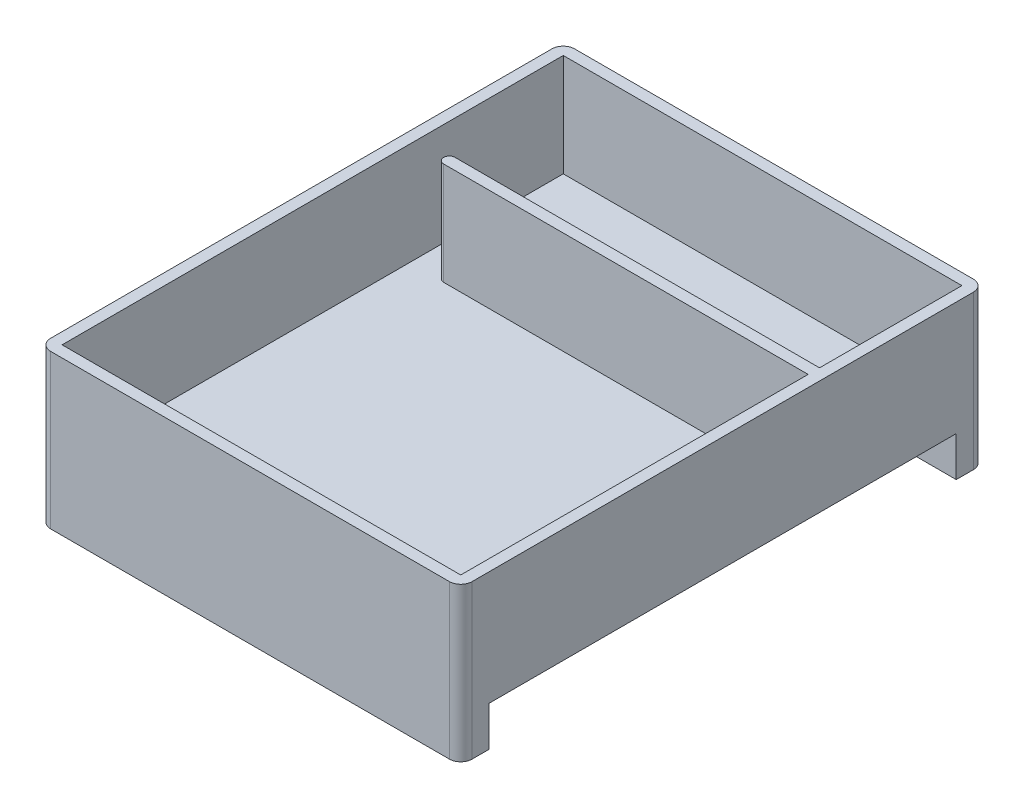
ISO-10303-21;
HEADER;
FILE_DESCRIPTION(('STEP AP214'),'2;1');
FILE_NAME('part.step','',(''),(''),'','','');
FILE_SCHEMA(('AUTOMOTIVE_DESIGN { 1 0 10303 214 1 1 1 1 }'));
ENDSEC;
DATA;
#1=APPLICATION_CONTEXT('core data for automotive mechanical design processes');
#2=APPLICATION_PROTOCOL_DEFINITION('international standard','automotive_design',2000,#1);
#3=PRODUCT_CONTEXT('',#1,'mechanical');
#4=PRODUCT('Part','Part','',(#3));
#5=PRODUCT_RELATED_PRODUCT_CATEGORY('part','',(#4));
#6=PRODUCT_DEFINITION_FORMATION('','',#4);
#7=PRODUCT_DEFINITION_CONTEXT('part definition',#1,'design');
#8=PRODUCT_DEFINITION('design','',#6,#7);
#9=PRODUCT_DEFINITION_SHAPE('','',#8);
#10=(LENGTH_UNIT() NAMED_UNIT(*) SI_UNIT(.MILLI.,.METRE.));
#11=(NAMED_UNIT(*) PLANE_ANGLE_UNIT() SI_UNIT($,.RADIAN.));
#12=(NAMED_UNIT(*) SI_UNIT($,.STERADIAN.) SOLID_ANGLE_UNIT());
#13=UNCERTAINTY_MEASURE_WITH_UNIT(LENGTH_MEASURE(1.E-05),#10,'distance_accuracy_value','');
#14=(GEOMETRIC_REPRESENTATION_CONTEXT(3) GLOBAL_UNCERTAINTY_ASSIGNED_CONTEXT((#13)) GLOBAL_UNIT_ASSIGNED_CONTEXT((#10,
#11,#12)) REPRESENTATION_CONTEXT('',''));
#15=CARTESIAN_POINT('',(0.,0.,0.));
#16=DIRECTION('',(0.,0.,1.));
#17=DIRECTION('',(1.,0.,0.));
#18=AXIS2_PLACEMENT_3D('',#15,#16,#17);
#19=CARTESIAN_POINT('',(0.,0.,0.));
#20=DIRECTION('',(0.,-1.,0.));
#21=DIRECTION('',(0.,0.,-1.));
#22=AXIS2_PLACEMENT_3D('',#19,#20,#21);
#23=PLANE('',#22);
#24=DIRECTION('',(0.,0.,1.));
#25=VECTOR('',#24,1.);
#26=CARTESIAN_POINT('',(0.,0.,0.));
#27=LINE('',#26,#25);
#28=CARTESIAN_POINT('',(0.,0.,-87.));
#29=VERTEX_POINT('',#28);
#30=CARTESIAN_POINT('',(0.,0.,-5.));
#31=VERTEX_POINT('',#30);
#32=EDGE_CURVE('E282',#29,#31,#27,.T.);
#33=ORIENTED_EDGE('',*,*,#32,.F.);
#34=DIRECTION('',(-1.,0.,0.));
#35=VECTOR('',#34,1.);
#36=CARTESIAN_POINT('',(0.,0.,-87.));
#37=LINE('',#36,#35);
#38=CARTESIAN_POINT('',(74.,0.,-87.));
#39=VERTEX_POINT('',#38);
#40=EDGE_CURVE('E198',#39,#29,#37,.T.);
#41=ORIENTED_EDGE('',*,*,#40,.F.);
#42=DIRECTION('',(0.,0.,-1.));
#43=VECTOR('',#42,1.);
#44=CARTESIAN_POINT('',(74.,0.,0.));
#45=LINE('',#44,#43);
#46=CARTESIAN_POINT('',(74.,0.,-5.));
#47=VERTEX_POINT('',#46);
#48=EDGE_CURVE('E290',#47,#39,#45,.T.);
#49=ORIENTED_EDGE('',*,*,#48,.F.);
#50=DIRECTION('',(1.,0.,0.));
#51=VECTOR('',#50,1.);
#52=CARTESIAN_POINT('',(0.,0.,-5.));
#53=LINE('',#52,#51);
#54=EDGE_CURVE('E209',#31,#47,#53,.T.);
#55=ORIENTED_EDGE('',*,*,#54,.F.);
#56=EDGE_LOOP('',(#33,#41,#49,#55));
#57=FACE_BOUND('',#56,.T.);
#58=ADVANCED_FACE('F39',(#57),#23,.T.);
#59=CARTESIAN_POINT('',(0.,20.,0.));
#60=DIRECTION('',(1.,0.,0.));
#61=DIRECTION('',(0.,0.,-1.));
#62=AXIS2_PLACEMENT_3D('',#59,#60,#61);
#63=PLANE('',#62);
#64=DIRECTION('',(0.,0.,1.));
#65=VECTOR('',#64,1.);
#66=CARTESIAN_POINT('',(0.,20.,0.));
#67=LINE('',#66,#65);
#68=CARTESIAN_POINT('',(0.,20.,-90.));
#69=VERTEX_POINT('',#68);
#70=CARTESIAN_POINT('',(0.,20.,-2.));
#71=VERTEX_POINT('',#70);
#72=EDGE_CURVE('E287',#69,#71,#67,.T.);
#73=ORIENTED_EDGE('',*,*,#72,.F.);
#74=DIRECTION('',(0.,-1.,0.));
#75=VECTOR('',#74,1.);
#76=CARTESIAN_POINT('',(0.,-7.,-90.));
#77=LINE('',#76,#75);
#78=CARTESIAN_POINT('',(0.,-7.,-90.));
#79=VERTEX_POINT('',#78);
#80=EDGE_CURVE('E206',#69,#79,#77,.T.);
#81=ORIENTED_EDGE('',*,*,#80,.T.);
#82=DIRECTION('',(0.,0.,-1.));
#83=VECTOR('',#82,1.);
#84=CARTESIAN_POINT('',(0.,-7.,-92.));
#85=LINE('',#84,#83);
#86=CARTESIAN_POINT('',(0.,-7.,-87.));
#87=VERTEX_POINT('',#86);
#88=EDGE_CURVE('E187',#87,#79,#85,.T.);
#89=ORIENTED_EDGE('',*,*,#88,.F.);
#90=DIRECTION('',(0.,1.,0.));
#91=VECTOR('',#90,1.);
#92=CARTESIAN_POINT('',(0.,-7.,-87.));
#93=LINE('',#92,#91);
#94=EDGE_CURVE('E193',#87,#29,#93,.T.);
#95=ORIENTED_EDGE('',*,*,#94,.T.);
#96=ORIENTED_EDGE('',*,*,#32,.T.);
#97=DIRECTION('',(0.,1.,0.));
#98=VECTOR('',#97,1.);
#99=CARTESIAN_POINT('',(0.,-7.,-5.));
#100=LINE('',#99,#98);
#101=CARTESIAN_POINT('',(0.,-7.,-5.));
#102=VERTEX_POINT('',#101);
#103=EDGE_CURVE('E229',#102,#31,#100,.T.);
#104=ORIENTED_EDGE('',*,*,#103,.F.);
#105=DIRECTION('',(0.,0.,-1.));
#106=VECTOR('',#105,1.);
#107=CARTESIAN_POINT('',(0.,-7.,0.));
#108=LINE('',#107,#106);
#109=CARTESIAN_POINT('',(0.,-7.,-2.));
#110=VERTEX_POINT('',#109);
#111=EDGE_CURVE('E215',#110,#102,#108,.T.);
#112=ORIENTED_EDGE('',*,*,#111,.F.);
#113=DIRECTION('',(0.,-1.,0.));
#114=VECTOR('',#113,1.);
#115=CARTESIAN_POINT('',(0.,20.,-2.));
#116=LINE('',#115,#114);
#117=EDGE_CURVE('E304',#110,#71,#116,.F.);
#118=ORIENTED_EDGE('',*,*,#117,.T.);
#119=EDGE_LOOP('',(#73,#81,#89,#95,#96,#104,#112,#118));
#120=FACE_BOUND('',#119,.T.);
#121=ADVANCED_FACE('F204',(#120),#63,.F.);
#122=CARTESIAN_POINT('',(0.,20.,0.));
#123=DIRECTION('',(0.,0.,-1.));
#124=DIRECTION('',(-1.,0.,0.));
#125=AXIS2_PLACEMENT_3D('',#122,#123,#124);
#126=PLANE('',#125);
#127=DIRECTION('',(-1.,0.,0.));
#128=VECTOR('',#127,1.);
#129=CARTESIAN_POINT('',(0.,-7.,0.));
#130=LINE('',#129,#128);
#131=CARTESIAN_POINT('',(72.,-7.,0.));
#132=VERTEX_POINT('',#131);
#133=CARTESIAN_POINT('',(2.,-7.,0.));
#134=VERTEX_POINT('',#133);
#135=EDGE_CURVE('E222',#132,#134,#130,.T.);
#136=ORIENTED_EDGE('',*,*,#135,.F.);
#137=DIRECTION('',(0.,-1.,0.));
#138=VECTOR('',#137,1.);
#139=CARTESIAN_POINT('',(72.,20.,0.));
#140=LINE('',#139,#138);
#141=CARTESIAN_POINT('',(72.,20.,0.));
#142=VERTEX_POINT('',#141);
#143=EDGE_CURVE('E314',#132,#142,#140,.F.);
#144=ORIENTED_EDGE('',*,*,#143,.T.);
#145=DIRECTION('',(1.,0.,0.));
#146=VECTOR('',#145,1.);
#147=CARTESIAN_POINT('',(0.,20.,0.));
#148=LINE('',#147,#146);
#149=CARTESIAN_POINT('',(2.,20.,0.));
#150=VERTEX_POINT('',#149);
#151=EDGE_CURVE('E289',#150,#142,#148,.T.);
#152=ORIENTED_EDGE('',*,*,#151,.F.);
#153=DIRECTION('',(0.,-1.,0.));
#154=VECTOR('',#153,1.);
#155=CARTESIAN_POINT('',(2.,20.,0.));
#156=LINE('',#155,#154);
#157=EDGE_CURVE('E296',#150,#134,#156,.T.);
#158=ORIENTED_EDGE('',*,*,#157,.T.);
#159=EDGE_LOOP('',(#136,#144,#152,#158));
#160=FACE_BOUND('',#159,.T.);
#161=ADVANCED_FACE('F385',(#160),#126,.F.);
#162=CARTESIAN_POINT('',(74.,20.,0.));
#163=DIRECTION('',(-1.,0.,0.));
#164=DIRECTION('',(0.,0.,1.));
#165=AXIS2_PLACEMENT_3D('',#162,#163,#164);
#166=PLANE('',#165);
#167=DIRECTION('',(0.,0.,1.));
#168=VECTOR('',#167,1.);
#169=CARTESIAN_POINT('',(74.,-7.,-92.));
#170=LINE('',#169,#168);
#171=CARTESIAN_POINT('',(74.,-7.,-90.));
#172=VERTEX_POINT('',#171);
#173=CARTESIAN_POINT('',(74.,-7.,-87.));
#174=VERTEX_POINT('',#173);
#175=EDGE_CURVE('E189',#172,#174,#170,.T.);
#176=ORIENTED_EDGE('',*,*,#175,.F.);
#177=DIRECTION('',(0.,-1.,0.));
#178=VECTOR('',#177,1.);
#179=CARTESIAN_POINT('',(74.,20.,-90.));
#180=LINE('',#179,#178);
#181=CARTESIAN_POINT('',(74.,20.,-90.));
#182=VERTEX_POINT('',#181);
#183=EDGE_CURVE('E332',#172,#182,#180,.F.);
#184=ORIENTED_EDGE('',*,*,#183,.T.);
#185=DIRECTION('',(0.,0.,-1.));
#186=VECTOR('',#185,1.);
#187=CARTESIAN_POINT('',(74.,20.,0.));
#188=LINE('',#187,#186);
#189=CARTESIAN_POINT('',(74.,20.,-2.));
#190=VERTEX_POINT('',#189);
#191=EDGE_CURVE('E293',#190,#182,#188,.T.);
#192=ORIENTED_EDGE('',*,*,#191,.F.);
#193=DIRECTION('',(0.,-1.,0.));
#194=VECTOR('',#193,1.);
#195=CARTESIAN_POINT('',(74.,20.,-2.));
#196=LINE('',#195,#194);
#197=CARTESIAN_POINT('',(74.,-7.,-2.));
#198=VERTEX_POINT('',#197);
#199=EDGE_CURVE('E309',#190,#198,#196,.T.);
#200=ORIENTED_EDGE('',*,*,#199,.T.);
#201=DIRECTION('',(0.,0.,1.));
#202=VECTOR('',#201,1.);
#203=CARTESIAN_POINT('',(74.,-7.,0.));
#204=LINE('',#203,#202);
#205=CARTESIAN_POINT('',(74.,-7.,-5.));
#206=VERTEX_POINT('',#205);
#207=EDGE_CURVE('E219',#206,#198,#204,.T.);
#208=ORIENTED_EDGE('',*,*,#207,.F.);
#209=DIRECTION('',(0.,1.,0.));
#210=VECTOR('',#209,1.);
#211=CARTESIAN_POINT('',(74.,-7.,-5.));
#212=LINE('',#211,#210);
#213=EDGE_CURVE('E224',#206,#47,#212,.T.);
#214=ORIENTED_EDGE('',*,*,#213,.T.);
#215=ORIENTED_EDGE('',*,*,#48,.T.);
#216=DIRECTION('',(0.,1.,0.));
#217=VECTOR('',#216,1.);
#218=CARTESIAN_POINT('',(74.,-7.,-87.));
#219=LINE('',#218,#217);
#220=EDGE_CURVE('E200',#174,#39,#219,.T.);
#221=ORIENTED_EDGE('',*,*,#220,.F.);
#222=EDGE_LOOP('',(#176,#184,#192,#200,#208,#214,#215,#221));
#223=FACE_BOUND('',#222,.T.);
#224=ADVANCED_FACE('F362',(#223),#166,.F.);
#225=CARTESIAN_POINT('',(0.,20.,0.));
#226=DIRECTION('',(0.,-1.,0.));
#227=DIRECTION('',(0.,0.,-1.));
#228=AXIS2_PLACEMENT_3D('',#225,#226,#227);
#229=PLANE('',#228);
#230=DIRECTION('',(1.,0.,0.));
#231=VECTOR('',#230,1.);
#232=CARTESIAN_POINT('',(0.,20.,-65.));
#233=LINE('',#232,#231);
#234=CARTESIAN_POINT('',(8.,20.,-65.));
#235=VERTEX_POINT('',#234);
#236=CARTESIAN_POINT('',(72.,20.,-65.));
#237=VERTEX_POINT('',#236);
#238=EDGE_CURVE('E237',#235,#237,#233,.T.);
#239=ORIENTED_EDGE('',*,*,#238,.F.);
#240=CARTESIAN_POINT('',(8.,20.,-64.));
#241=DIRECTION('',(0.,-1.,0.));
#242=DIRECTION('',(0.,0.,-1.));
#243=AXIS2_PLACEMENT_3D('',#240,#241,#242);
#244=CIRCLE('',#243,1.);
#245=CARTESIAN_POINT('',(7.,20.,-64.));
#246=VERTEX_POINT('',#245);
#247=EDGE_CURVE('E339',#235,#246,#244,.F.);
#248=ORIENTED_EDGE('',*,*,#247,.T.);
#249=CARTESIAN_POINT('',(8.,20.,-64.));
#250=DIRECTION('',(0.,-1.,0.));
#251=DIRECTION('',(0.,0.,-1.));
#252=AXIS2_PLACEMENT_3D('',#249,#250,#251);
#253=CIRCLE('',#252,1.);
#254=CARTESIAN_POINT('',(8.,20.,-63.));
#255=VERTEX_POINT('',#254);
#256=EDGE_CURVE('E337',#246,#255,#253,.F.);
#257=ORIENTED_EDGE('',*,*,#256,.T.);
#258=DIRECTION('',(-1.,0.,0.));
#259=VECTOR('',#258,1.);
#260=CARTESIAN_POINT('',(2.,20.,-63.));
#261=LINE('',#260,#259);
#262=CARTESIAN_POINT('',(72.,20.,-63.));
#263=VERTEX_POINT('',#262);
#264=EDGE_CURVE('E273',#263,#255,#261,.T.);
#265=ORIENTED_EDGE('',*,*,#264,.F.);
#266=DIRECTION('',(0.,0.,-1.));
#267=VECTOR('',#266,1.);
#268=CARTESIAN_POINT('',(72.,20.,-63.));
#269=LINE('',#268,#267);
#270=CARTESIAN_POINT('',(72.,20.,-2.));
#271=VERTEX_POINT('',#270);
#272=EDGE_CURVE('E258',#271,#263,#269,.T.);
#273=ORIENTED_EDGE('',*,*,#272,.F.);
#274=DIRECTION('',(1.,0.,0.));
#275=VECTOR('',#274,1.);
#276=CARTESIAN_POINT('',(2.00000000000001,20.,-2.));
#277=LINE('',#276,#275);
#278=CARTESIAN_POINT('',(2.00000000000001,20.,-2.));
#279=VERTEX_POINT('',#278);
#280=EDGE_CURVE('E263',#279,#271,#277,.T.);
#281=ORIENTED_EDGE('',*,*,#280,.F.);
#282=DIRECTION('',(0.,0.,1.));
#283=VECTOR('',#282,1.);
#284=CARTESIAN_POINT('',(2.,20.,-63.));
#285=LINE('',#284,#283);
#286=CARTESIAN_POINT('',(2.,20.,-90.));
#287=VERTEX_POINT('',#286);
#288=EDGE_CURVE('E275',#287,#279,#285,.T.);
#289=ORIENTED_EDGE('',*,*,#288,.F.);
#290=DIRECTION('',(1.,0.,0.));
#291=VECTOR('',#290,1.);
#292=CARTESIAN_POINT('',(0.,20.,-90.));
#293=LINE('',#292,#291);
#294=CARTESIAN_POINT('',(72.,20.,-90.));
#295=VERTEX_POINT('',#294);
#296=EDGE_CURVE('E244',#287,#295,#293,.T.);
#297=ORIENTED_EDGE('',*,*,#296,.T.);
#298=DIRECTION('',(0.,0.,1.));
#299=VECTOR('',#298,1.);
#300=CARTESIAN_POINT('',(72.,20.,0.));
#301=LINE('',#300,#299);
#302=EDGE_CURVE('E232',#295,#237,#301,.T.);
#303=ORIENTED_EDGE('',*,*,#302,.T.);
#304=EDGE_LOOP('',(#239,#248,#257,#265,#273,#281,#289,#297,#303));
#305=FACE_BOUND('',#304,.T.);
#306=DIRECTION('',(1.,0.,0.));
#307=VECTOR('',#306,1.);
#308=CARTESIAN_POINT('',(0.,20.,-92.));
#309=LINE('',#308,#307);
#310=CARTESIAN_POINT('',(2.,20.,-92.));
#311=VERTEX_POINT('',#310);
#312=CARTESIAN_POINT('',(72.,20.,-92.));
#313=VERTEX_POINT('',#312);
#314=EDGE_CURVE('E251',#311,#313,#309,.T.);
#315=ORIENTED_EDGE('',*,*,#314,.F.);
#316=CARTESIAN_POINT('',(2.,20.,-90.));
#317=DIRECTION('',(0.,-1.,0.));
#318=DIRECTION('',(0.,0.,-1.));
#319=AXIS2_PLACEMENT_3D('',#316,#317,#318);
#320=CIRCLE('',#319,2.);
#321=EDGE_CURVE('E330',#311,#69,#320,.F.);
#322=ORIENTED_EDGE('',*,*,#321,.T.);
#323=ORIENTED_EDGE('',*,*,#72,.T.);
#324=CARTESIAN_POINT('',(2.,20.,-2.));
#325=DIRECTION('',(0.,-1.,0.));
#326=DIRECTION('',(0.,0.,-1.));
#327=AXIS2_PLACEMENT_3D('',#324,#325,#326);
#328=CIRCLE('',#327,2.);
#329=EDGE_CURVE('E307',#71,#150,#328,.F.);
#330=ORIENTED_EDGE('',*,*,#329,.T.);
#331=ORIENTED_EDGE('',*,*,#151,.T.);
#332=CARTESIAN_POINT('',(72.,20.,-2.));
#333=DIRECTION('',(0.,-1.,0.));
#334=DIRECTION('',(0.,0.,-1.));
#335=AXIS2_PLACEMENT_3D('',#332,#333,#334);
#336=CIRCLE('',#335,2.);
#337=EDGE_CURVE('E316',#142,#190,#336,.F.);
#338=ORIENTED_EDGE('',*,*,#337,.T.);
#339=ORIENTED_EDGE('',*,*,#191,.T.);
#340=CARTESIAN_POINT('',(72.,20.,-90.));
#341=DIRECTION('',(0.,-1.,0.));
#342=DIRECTION('',(0.,0.,-1.));
#343=AXIS2_PLACEMENT_3D('',#340,#341,#342);
#344=CIRCLE('',#343,2.);
#345=EDGE_CURVE('E328',#182,#313,#344,.F.);
#346=ORIENTED_EDGE('',*,*,#345,.T.);
#347=EDGE_LOOP('',(#315,#322,#323,#330,#331,#338,#339,#346));
#348=FACE_BOUND('',#347,.T.);
#349=ADVANCED_FACE('F356',(#305,#348),#229,.F.);
#350=CARTESIAN_POINT('',(72.,2.,-63.));
#351=DIRECTION('',(1.,0.,0.));
#352=DIRECTION('',(0.,0.,-1.));
#353=AXIS2_PLACEMENT_3D('',#350,#351,#352);
#354=PLANE('',#353);
#355=ORIENTED_EDGE('',*,*,#272,.T.);
#356=DIRECTION('',(0.,1.,0.));
#357=VECTOR('',#356,1.);
#358=CARTESIAN_POINT('',(72.,2.,-63.));
#359=LINE('',#358,#357);
#360=CARTESIAN_POINT('',(72.,2.,-63.));
#361=VERTEX_POINT('',#360);
#362=EDGE_CURVE('E271',#361,#263,#359,.T.);
#363=ORIENTED_EDGE('',*,*,#362,.F.);
#364=DIRECTION('',(0.,0.,-1.));
#365=VECTOR('',#364,1.);
#366=CARTESIAN_POINT('',(72.,2.,-63.));
#367=LINE('',#366,#365);
#368=CARTESIAN_POINT('',(72.,2.,-2.));
#369=VERTEX_POINT('',#368);
#370=EDGE_CURVE('E259',#369,#361,#367,.T.);
#371=ORIENTED_EDGE('',*,*,#370,.F.);
#372=DIRECTION('',(0.,1.,0.));
#373=VECTOR('',#372,1.);
#374=CARTESIAN_POINT('',(72.,2.,-2.));
#375=LINE('',#374,#373);
#376=EDGE_CURVE('E280',#369,#271,#375,.T.);
#377=ORIENTED_EDGE('',*,*,#376,.T.);
#378=EDGE_LOOP('',(#355,#363,#371,#377));
#379=FACE_BOUND('',#378,.T.);
#380=ADVANCED_FACE('F457',(#379),#354,.F.);
#381=CARTESIAN_POINT('',(2.00000000000001,2.,-2.));
#382=DIRECTION('',(0.,0.,1.));
#383=DIRECTION('',(1.,0.,0.));
#384=AXIS2_PLACEMENT_3D('',#381,#382,#383);
#385=PLANE('',#384);
#386=ORIENTED_EDGE('',*,*,#280,.T.);
#387=ORIENTED_EDGE('',*,*,#376,.F.);
#388=DIRECTION('',(1.,0.,0.));
#389=VECTOR('',#388,1.);
#390=CARTESIAN_POINT('',(2.00000000000001,2.,-2.));
#391=LINE('',#390,#389);
#392=CARTESIAN_POINT('',(2.00000000000001,2.,-2.));
#393=VERTEX_POINT('',#392);
#394=EDGE_CURVE('E268',#393,#369,#391,.T.);
#395=ORIENTED_EDGE('',*,*,#394,.F.);
#396=DIRECTION('',(0.,1.,0.));
#397=VECTOR('',#396,1.);
#398=CARTESIAN_POINT('',(2.00000000000001,2.,-2.));
#399=LINE('',#398,#397);
#400=EDGE_CURVE('E283',#393,#279,#399,.T.);
#401=ORIENTED_EDGE('',*,*,#400,.T.);
#402=EDGE_LOOP('',(#386,#387,#395,#401));
#403=FACE_BOUND('',#402,.T.);
#404=ADVANCED_FACE('F453',(#403),#385,.F.);
#405=CARTESIAN_POINT('',(2.,2.,-63.));
#406=DIRECTION('',(-1.,0.,0.));
#407=DIRECTION('',(0.,0.,1.));
#408=AXIS2_PLACEMENT_3D('',#405,#406,#407);
#409=PLANE('',#408);
#410=ORIENTED_EDGE('',*,*,#288,.T.);
#411=ORIENTED_EDGE('',*,*,#400,.F.);
#412=DIRECTION('',(0.,0.,1.));
#413=VECTOR('',#412,1.);
#414=CARTESIAN_POINT('',(2.,2.,-63.));
#415=LINE('',#414,#413);
#416=CARTESIAN_POINT('',(2.,2.,-90.));
#417=VERTEX_POINT('',#416);
#418=EDGE_CURVE('E265',#417,#393,#415,.T.);
#419=ORIENTED_EDGE('',*,*,#418,.F.);
#420=DIRECTION('',(0.,1.,0.));
#421=VECTOR('',#420,1.);
#422=CARTESIAN_POINT('',(2.,2.,-90.));
#423=LINE('',#422,#421);
#424=EDGE_CURVE('E252',#417,#287,#423,.T.);
#425=ORIENTED_EDGE('',*,*,#424,.T.);
#426=EDGE_LOOP('',(#410,#411,#419,#425));
#427=FACE_BOUND('',#426,.T.);
#428=ADVANCED_FACE('F456',(#427),#409,.F.);
#429=CARTESIAN_POINT('',(2.,2.,-63.));
#430=DIRECTION('',(0.,0.,-1.));
#431=DIRECTION('',(-1.,0.,0.));
#432=AXIS2_PLACEMENT_3D('',#429,#430,#431);
#433=PLANE('',#432);
#434=ORIENTED_EDGE('',*,*,#264,.T.);
#435=DIRECTION('',(0.,1.,0.));
#436=VECTOR('',#435,1.);
#437=CARTESIAN_POINT('',(8.,2.,-63.));
#438=LINE('',#437,#436);
#439=CARTESIAN_POINT('',(8.,2.,-63.));
#440=VERTEX_POINT('',#439);
#441=EDGE_CURVE('E61',#255,#440,#438,.F.);
#442=ORIENTED_EDGE('',*,*,#441,.T.);
#443=DIRECTION('',(-1.,0.,0.));
#444=VECTOR('',#443,1.);
#445=CARTESIAN_POINT('',(2.,2.,-63.));
#446=LINE('',#445,#444);
#447=EDGE_CURVE('E262',#361,#440,#446,.T.);
#448=ORIENTED_EDGE('',*,*,#447,.F.);
#449=ORIENTED_EDGE('',*,*,#362,.T.);
#450=EDGE_LOOP('',(#434,#442,#448,#449));
#451=FACE_BOUND('',#450,.T.);
#452=ADVANCED_FACE('F452',(#451),#433,.F.);
#453=CARTESIAN_POINT('',(0.,2.,0.));
#454=DIRECTION('',(0.,1.,0.));
#455=DIRECTION('',(0.,0.,1.));
#456=AXIS2_PLACEMENT_3D('',#453,#454,#455);
#457=PLANE('',#456);
#458=ORIENTED_EDGE('',*,*,#370,.T.);
#459=ORIENTED_EDGE('',*,*,#447,.T.);
#460=CARTESIAN_POINT('',(8.,2.,-64.));
#461=DIRECTION('',(0.,1.,0.));
#462=DIRECTION('',(0.,0.,1.));
#463=AXIS2_PLACEMENT_3D('',#460,#461,#462);
#464=CIRCLE('',#463,1.);
#465=CARTESIAN_POINT('',(7.,2.,-64.));
#466=VERTEX_POINT('',#465);
#467=EDGE_CURVE('E11',#440,#466,#464,.F.);
#468=ORIENTED_EDGE('',*,*,#467,.T.);
#469=CARTESIAN_POINT('',(8.,2.,-64.));
#470=DIRECTION('',(0.,1.,0.));
#471=DIRECTION('',(0.,0.,1.));
#472=AXIS2_PLACEMENT_3D('',#469,#470,#471);
#473=CIRCLE('',#472,1.);
#474=CARTESIAN_POINT('',(8.,2.,-65.));
#475=VERTEX_POINT('',#474);
#476=EDGE_CURVE('E48',#466,#475,#473,.F.);
#477=ORIENTED_EDGE('',*,*,#476,.T.);
#478=DIRECTION('',(1.,0.,0.));
#479=VECTOR('',#478,1.);
#480=CARTESIAN_POINT('',(0.,2.,-65.));
#481=LINE('',#480,#479);
#482=CARTESIAN_POINT('',(72.,2.,-65.));
#483=VERTEX_POINT('',#482);
#484=EDGE_CURVE('E239',#475,#483,#481,.T.);
#485=ORIENTED_EDGE('',*,*,#484,.T.);
#486=DIRECTION('',(0.,0.,1.));
#487=VECTOR('',#486,1.);
#488=CARTESIAN_POINT('',(72.,2.,0.));
#489=LINE('',#488,#487);
#490=CARTESIAN_POINT('',(72.,2.,-90.));
#491=VERTEX_POINT('',#490);
#492=EDGE_CURVE('E233',#491,#483,#489,.T.);
#493=ORIENTED_EDGE('',*,*,#492,.F.);
#494=DIRECTION('',(1.,0.,0.));
#495=VECTOR('',#494,1.);
#496=CARTESIAN_POINT('',(0.,2.,-90.));
#497=LINE('',#496,#495);
#498=EDGE_CURVE('E236',#417,#491,#497,.T.);
#499=ORIENTED_EDGE('',*,*,#498,.F.);
#500=ORIENTED_EDGE('',*,*,#418,.T.);
#501=ORIENTED_EDGE('',*,*,#394,.T.);
#502=EDGE_LOOP('',(#458,#459,#468,#477,#485,#493,#499,#500,#501));
#503=FACE_BOUND('',#502,.T.);
#504=ADVANCED_FACE('F344',(#503),#457,.T.);
#505=CARTESIAN_POINT('',(0.,20.,-92.));
#506=DIRECTION('',(0.,0.,-1.));
#507=DIRECTION('',(-1.,0.,0.));
#508=AXIS2_PLACEMENT_3D('',#505,#506,#507);
#509=PLANE('',#508);
#510=DIRECTION('',(1.,0.,0.));
#511=VECTOR('',#510,1.);
#512=CARTESIAN_POINT('',(0.,-7.,-92.));
#513=LINE('',#512,#511);
#514=CARTESIAN_POINT('',(2.,-7.,-92.));
#515=VERTEX_POINT('',#514);
#516=CARTESIAN_POINT('',(72.,-7.,-92.));
#517=VERTEX_POINT('',#516);
#518=EDGE_CURVE('E207',#515,#517,#513,.T.);
#519=ORIENTED_EDGE('',*,*,#518,.F.);
#520=DIRECTION('',(0.,-1.,0.));
#521=VECTOR('',#520,1.);
#522=CARTESIAN_POINT('',(2.,20.,-92.));
#523=LINE('',#522,#521);
#524=EDGE_CURVE('E326',#515,#311,#523,.F.);
#525=ORIENTED_EDGE('',*,*,#524,.T.);
#526=ORIENTED_EDGE('',*,*,#314,.T.);
#527=DIRECTION('',(0.,-1.,0.));
#528=VECTOR('',#527,1.);
#529=CARTESIAN_POINT('',(72.,-7.,-92.));
#530=LINE('',#529,#528);
#531=EDGE_CURVE('E323',#313,#517,#530,.T.);
#532=ORIENTED_EDGE('',*,*,#531,.T.);
#533=EDGE_LOOP('',(#519,#525,#526,#532));
#534=FACE_BOUND('',#533,.T.);
#535=ADVANCED_FACE('F398',(#534),#509,.T.);
#536=CARTESIAN_POINT('',(0.,2.,-65.));
#537=DIRECTION('',(0.,0.,1.));
#538=DIRECTION('',(1.,0.,0.));
#539=AXIS2_PLACEMENT_3D('',#536,#537,#538);
#540=PLANE('',#539);
#541=ORIENTED_EDGE('',*,*,#484,.F.);
#542=DIRECTION('',(0.,1.,0.));
#543=VECTOR('',#542,1.);
#544=CARTESIAN_POINT('',(8.,2.,-65.));
#545=LINE('',#544,#543);
#546=EDGE_CURVE('E334',#475,#235,#545,.T.);
#547=ORIENTED_EDGE('',*,*,#546,.T.);
#548=ORIENTED_EDGE('',*,*,#238,.T.);
#549=DIRECTION('',(0.,1.,0.));
#550=VECTOR('',#549,1.);
#551=CARTESIAN_POINT('',(72.,2.,-65.));
#552=LINE('',#551,#550);
#553=EDGE_CURVE('E248',#483,#237,#552,.T.);
#554=ORIENTED_EDGE('',*,*,#553,.F.);
#555=EDGE_LOOP('',(#541,#547,#548,#554));
#556=FACE_BOUND('',#555,.T.);
#557=ADVANCED_FACE('F351',(#556),#540,.F.);
#558=CARTESIAN_POINT('',(72.,2.,0.));
#559=DIRECTION('',(-1.,0.,0.));
#560=DIRECTION('',(0.,0.,1.));
#561=AXIS2_PLACEMENT_3D('',#558,#559,#560);
#562=PLANE('',#561);
#563=ORIENTED_EDGE('',*,*,#302,.F.);
#564=DIRECTION('',(0.,1.,0.));
#565=VECTOR('',#564,1.);
#566=CARTESIAN_POINT('',(72.,2.,-90.));
#567=LINE('',#566,#565);
#568=EDGE_CURVE('E241',#491,#295,#567,.T.);
#569=ORIENTED_EDGE('',*,*,#568,.F.);
#570=ORIENTED_EDGE('',*,*,#492,.T.);
#571=ORIENTED_EDGE('',*,*,#553,.T.);
#572=EDGE_LOOP('',(#563,#569,#570,#571));
#573=FACE_BOUND('',#572,.T.);
#574=ADVANCED_FACE('F441',(#573),#562,.T.);
#575=CARTESIAN_POINT('',(0.,2.,-90.));
#576=DIRECTION('',(0.,0.,1.));
#577=DIRECTION('',(1.,0.,0.));
#578=AXIS2_PLACEMENT_3D('',#575,#576,#577);
#579=PLANE('',#578);
#580=ORIENTED_EDGE('',*,*,#296,.F.);
#581=ORIENTED_EDGE('',*,*,#424,.F.);
#582=ORIENTED_EDGE('',*,*,#498,.T.);
#583=ORIENTED_EDGE('',*,*,#568,.T.);
#584=EDGE_LOOP('',(#580,#581,#582,#583));
#585=FACE_BOUND('',#584,.T.);
#586=ADVANCED_FACE('F438',(#585),#579,.T.);
#587=CARTESIAN_POINT('',(0.,-7.,-5.));
#588=DIRECTION('',(0.,0.,1.));
#589=DIRECTION('',(1.,0.,0.));
#590=AXIS2_PLACEMENT_3D('',#587,#588,#589);
#591=PLANE('',#590);
#592=ORIENTED_EDGE('',*,*,#54,.T.);
#593=ORIENTED_EDGE('',*,*,#213,.F.);
#594=DIRECTION('',(1.,0.,0.));
#595=VECTOR('',#594,1.);
#596=CARTESIAN_POINT('',(0.,-7.,-5.));
#597=LINE('',#596,#595);
#598=EDGE_CURVE('E217',#102,#206,#597,.T.);
#599=ORIENTED_EDGE('',*,*,#598,.F.);
#600=ORIENTED_EDGE('',*,*,#103,.T.);
#601=EDGE_LOOP('',(#592,#593,#599,#600));
#602=FACE_BOUND('',#601,.T.);
#603=ADVANCED_FACE('F369',(#602),#591,.F.);
#604=CARTESIAN_POINT('',(0.,-7.,0.));
#605=DIRECTION('',(0.,-1.,0.));
#606=DIRECTION('',(0.,0.,-1.));
#607=AXIS2_PLACEMENT_3D('',#604,#605,#606);
#608=PLANE('',#607);
#609=ORIENTED_EDGE('',*,*,#207,.T.);
#610=CARTESIAN_POINT('',(72.,-7.,-2.));
#611=DIRECTION('',(0.,-1.,0.));
#612=DIRECTION('',(0.,0.,-1.));
#613=AXIS2_PLACEMENT_3D('',#610,#611,#612);
#614=CIRCLE('',#613,2.);
#615=EDGE_CURVE('E312',#198,#132,#614,.T.);
#616=ORIENTED_EDGE('',*,*,#615,.T.);
#617=ORIENTED_EDGE('',*,*,#135,.T.);
#618=CARTESIAN_POINT('',(2.,-7.,-2.));
#619=DIRECTION('',(0.,-1.,0.));
#620=DIRECTION('',(0.,0.,-1.));
#621=AXIS2_PLACEMENT_3D('',#618,#619,#620);
#622=CIRCLE('',#621,2.);
#623=EDGE_CURVE('E302',#134,#110,#622,.T.);
#624=ORIENTED_EDGE('',*,*,#623,.T.);
#625=ORIENTED_EDGE('',*,*,#111,.T.);
#626=ORIENTED_EDGE('',*,*,#598,.T.);
#627=EDGE_LOOP('',(#609,#616,#617,#624,#625,#626));
#628=FACE_BOUND('',#627,.T.);
#629=ADVANCED_FACE('F431',(#628),#608,.T.);
#630=CARTESIAN_POINT('',(0.,-7.,-87.));
#631=DIRECTION('',(0.,0.,-1.));
#632=DIRECTION('',(-1.,0.,0.));
#633=AXIS2_PLACEMENT_3D('',#630,#631,#632);
#634=PLANE('',#633);
#635=ORIENTED_EDGE('',*,*,#40,.T.);
#636=ORIENTED_EDGE('',*,*,#94,.F.);
#637=DIRECTION('',(-1.,0.,0.));
#638=VECTOR('',#637,1.);
#639=CARTESIAN_POINT('',(0.,-7.,-87.));
#640=LINE('',#639,#638);
#641=EDGE_CURVE('E183',#174,#87,#640,.T.);
#642=ORIENTED_EDGE('',*,*,#641,.F.);
#643=ORIENTED_EDGE('',*,*,#220,.T.);
#644=EDGE_LOOP('',(#635,#636,#642,#643));
#645=FACE_BOUND('',#644,.T.);
#646=ADVANCED_FACE('F197',(#645),#634,.F.);
#647=CARTESIAN_POINT('',(0.,-7.,0.));
#648=DIRECTION('',(0.,1.,0.));
#649=DIRECTION('',(0.,0.,1.));
#650=AXIS2_PLACEMENT_3D('',#647,#648,#649);
#651=PLANE('',#650);
#652=ORIENTED_EDGE('',*,*,#88,.T.);
#653=CARTESIAN_POINT('',(2.,-7.,-90.));
#654=DIRECTION('',(0.,1.,0.));
#655=DIRECTION('',(0.,0.,1.));
#656=AXIS2_PLACEMENT_3D('',#653,#654,#655);
#657=CIRCLE('',#656,2.);
#658=EDGE_CURVE('E321',#79,#515,#657,.F.);
#659=ORIENTED_EDGE('',*,*,#658,.T.);
#660=ORIENTED_EDGE('',*,*,#518,.T.);
#661=CARTESIAN_POINT('',(72.,-7.,-90.));
#662=DIRECTION('',(0.,1.,0.));
#663=DIRECTION('',(0.,0.,1.));
#664=AXIS2_PLACEMENT_3D('',#661,#662,#663);
#665=CIRCLE('',#664,2.);
#666=EDGE_CURVE('E319',#517,#172,#665,.F.);
#667=ORIENTED_EDGE('',*,*,#666,.T.);
#668=ORIENTED_EDGE('',*,*,#175,.T.);
#669=ORIENTED_EDGE('',*,*,#641,.T.);
#670=EDGE_LOOP('',(#652,#659,#660,#667,#668,#669));
#671=FACE_BOUND('',#670,.T.);
#672=ADVANCED_FACE('F185',(#671),#651,.F.);
#673=CARTESIAN_POINT('',(2.,20.,-2.));
#674=DIRECTION('',(0.,-1.,0.));
#675=DIRECTION('',(0.,0.,-1.));
#676=AXIS2_PLACEMENT_3D('',#673,#674,#675);
#677=CYLINDRICAL_SURFACE('',#676,2.);
#678=ORIENTED_EDGE('',*,*,#329,.F.);
#679=ORIENTED_EDGE('',*,*,#117,.F.);
#680=ORIENTED_EDGE('',*,*,#623,.F.);
#681=ORIENTED_EDGE('',*,*,#157,.F.);
#682=EDGE_LOOP('',(#678,#679,#680,#681));
#683=FACE_BOUND('',#682,.T.);
#684=ADVANCED_FACE('F378',(#683),#677,.T.);
#685=CARTESIAN_POINT('',(72.,20.,-2.));
#686=DIRECTION('',(0.,-1.,0.));
#687=DIRECTION('',(0.,0.,-1.));
#688=AXIS2_PLACEMENT_3D('',#685,#686,#687);
#689=CYLINDRICAL_SURFACE('',#688,2.);
#690=ORIENTED_EDGE('',*,*,#337,.F.);
#691=ORIENTED_EDGE('',*,*,#143,.F.);
#692=ORIENTED_EDGE('',*,*,#615,.F.);
#693=ORIENTED_EDGE('',*,*,#199,.F.);
#694=EDGE_LOOP('',(#690,#691,#692,#693));
#695=FACE_BOUND('',#694,.T.);
#696=ADVANCED_FACE('F388',(#695),#689,.T.);
#697=CARTESIAN_POINT('',(2.,20.,-90.));
#698=DIRECTION('',(0.,1.,0.));
#699=DIRECTION('',(0.,0.,1.));
#700=AXIS2_PLACEMENT_3D('',#697,#698,#699);
#701=CYLINDRICAL_SURFACE('',#700,2.);
#702=ORIENTED_EDGE('',*,*,#321,.F.);
#703=ORIENTED_EDGE('',*,*,#524,.F.);
#704=ORIENTED_EDGE('',*,*,#658,.F.);
#705=ORIENTED_EDGE('',*,*,#80,.F.);
#706=EDGE_LOOP('',(#702,#703,#704,#705));
#707=FACE_BOUND('',#706,.T.);
#708=ADVANCED_FACE('F401',(#707),#701,.T.);
#709=CARTESIAN_POINT('',(72.,20.,-90.));
#710=DIRECTION('',(0.,1.,0.));
#711=DIRECTION('',(0.,0.,1.));
#712=AXIS2_PLACEMENT_3D('',#709,#710,#711);
#713=CYLINDRICAL_SURFACE('',#712,2.);
#714=ORIENTED_EDGE('',*,*,#345,.F.);
#715=ORIENTED_EDGE('',*,*,#183,.F.);
#716=ORIENTED_EDGE('',*,*,#666,.F.);
#717=ORIENTED_EDGE('',*,*,#531,.F.);
#718=EDGE_LOOP('',(#714,#715,#716,#717));
#719=FACE_BOUND('',#718,.T.);
#720=ADVANCED_FACE('F393',(#719),#713,.T.);
#721=CARTESIAN_POINT('',(8.,2.,-64.));
#722=DIRECTION('',(0.,1.,0.));
#723=DIRECTION('',(0.,0.,1.));
#724=AXIS2_PLACEMENT_3D('',#721,#722,#723);
#725=CYLINDRICAL_SURFACE('',#724,1.);
#726=DIRECTION('',(0.,1.,0.));
#727=VECTOR('',#726,1.);
#728=CARTESIAN_POINT('',(7.,2.,-64.));
#729=LINE('',#728,#727);
#730=EDGE_CURVE('E43',#466,#246,#729,.T.);
#731=ORIENTED_EDGE('',*,*,#730,.F.);
#732=ORIENTED_EDGE('',*,*,#467,.F.);
#733=ORIENTED_EDGE('',*,*,#441,.F.);
#734=ORIENTED_EDGE('',*,*,#256,.F.);
#735=EDGE_LOOP('',(#731,#732,#733,#734));
#736=FACE_BOUND('',#735,.T.);
#737=ADVANCED_FACE('F41',(#736),#725,.T.);
#738=CARTESIAN_POINT('',(8.,2.,-64.));
#739=DIRECTION('',(0.,1.,0.));
#740=DIRECTION('',(0.,0.,1.));
#741=AXIS2_PLACEMENT_3D('',#738,#739,#740);
#742=CYLINDRICAL_SURFACE('',#741,1.);
#743=ORIENTED_EDGE('',*,*,#476,.F.);
#744=ORIENTED_EDGE('',*,*,#730,.T.);
#745=ORIENTED_EDGE('',*,*,#247,.F.);
#746=ORIENTED_EDGE('',*,*,#546,.F.);
#747=EDGE_LOOP('',(#743,#744,#745,#746));
#748=FACE_BOUND('',#747,.T.);
#749=ADVANCED_FACE('F353',(#748),#742,.T.);
#750=CLOSED_SHELL('',(#58,#121,#161,#224,#349,#380,#404,#428,#452,#504,#535,#557,#574,#586,#603,
#629,#646,#672,#684,#696,#708,#720,#737,#749));
#751=MANIFOLD_SOLID_BREP('B2',#750);
#752=ADVANCED_BREP_SHAPE_REPRESENTATION('',(#18,#751),#14);
#753=SHAPE_DEFINITION_REPRESENTATION(#9,#752);
ENDSEC;
END-ISO-10303-21;
